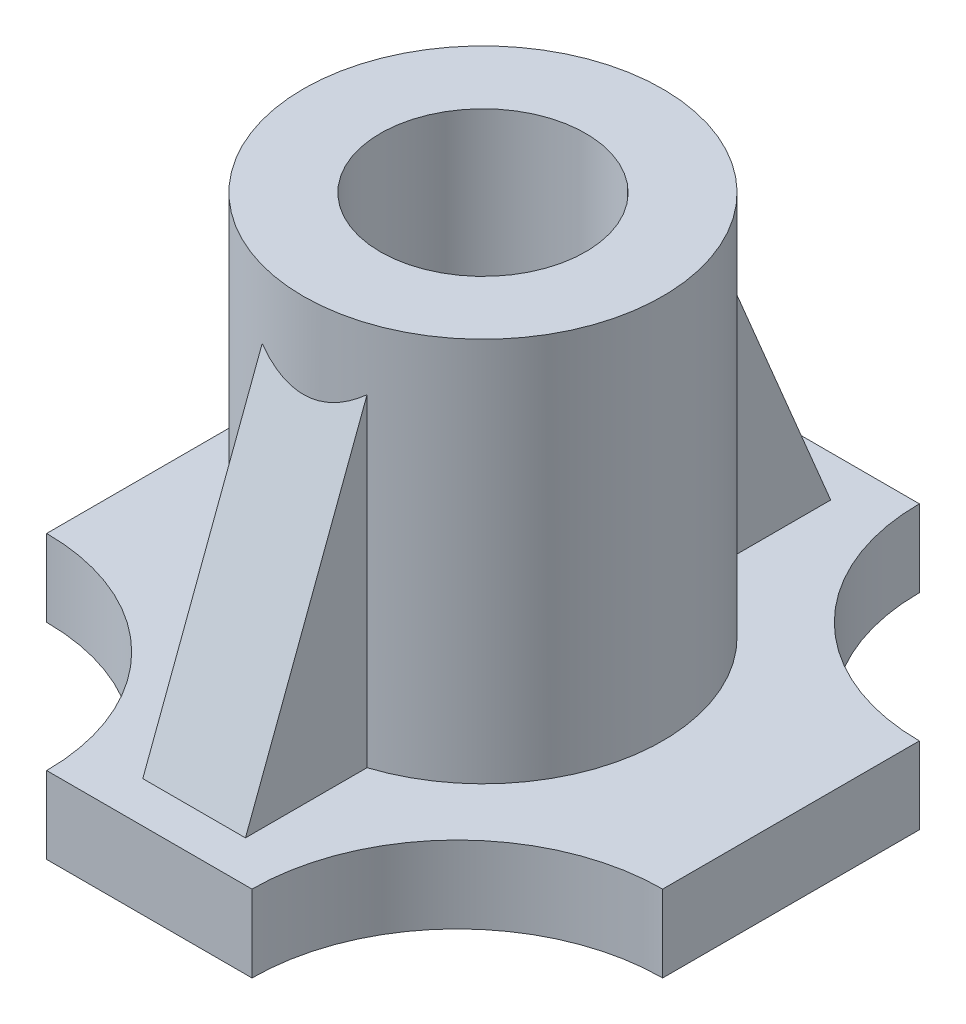
ISO-10303-21;
HEADER;
FILE_DESCRIPTION(('STEP AP214'),'2;1');
FILE_NAME('part.step','',(''),(''),'','','');
FILE_SCHEMA(('AUTOMOTIVE_DESIGN { 1 0 10303 214 1 1 1 1 }'));
ENDSEC;
DATA;
#1=APPLICATION_CONTEXT('core data for automotive mechanical design processes');
#2=APPLICATION_PROTOCOL_DEFINITION('international standard','automotive_design',2000,#1);
#3=PRODUCT_CONTEXT('',#1,'mechanical');
#4=PRODUCT('Part','Part','',(#3));
#5=PRODUCT_RELATED_PRODUCT_CATEGORY('part','',(#4));
#6=PRODUCT_DEFINITION_FORMATION('','',#4);
#7=PRODUCT_DEFINITION_CONTEXT('part definition',#1,'design');
#8=PRODUCT_DEFINITION('design','',#6,#7);
#9=PRODUCT_DEFINITION_SHAPE('','',#8);
#10=(LENGTH_UNIT() NAMED_UNIT(*) SI_UNIT(.MILLI.,.METRE.));
#11=(NAMED_UNIT(*) PLANE_ANGLE_UNIT() SI_UNIT($,.RADIAN.));
#12=(NAMED_UNIT(*) SI_UNIT($,.STERADIAN.) SOLID_ANGLE_UNIT());
#13=UNCERTAINTY_MEASURE_WITH_UNIT(LENGTH_MEASURE(1.E-05),#10,'distance_accuracy_value','');
#14=(GEOMETRIC_REPRESENTATION_CONTEXT(3) GLOBAL_UNCERTAINTY_ASSIGNED_CONTEXT((#13)) GLOBAL_UNIT_ASSIGNED_CONTEXT((#10,
#11,#12)) REPRESENTATION_CONTEXT('',''));
#15=CARTESIAN_POINT('',(0.,0.,0.));
#16=DIRECTION('',(0.,0.,1.));
#17=DIRECTION('',(1.,0.,0.));
#18=AXIS2_PLACEMENT_3D('',#15,#16,#17);
#19=CARTESIAN_POINT('',(59.2727272727272,-15.,0.));
#20=DIRECTION('',(1.,0.,0.));
#21=DIRECTION('',(0.,0.,-1.));
#22=AXIS2_PLACEMENT_3D('',#19,#20,#21);
#23=PLANE('',#22);
#24=DIRECTION('',(0.,1.,0.));
#25=VECTOR('',#24,1.);
#26=CARTESIAN_POINT('',(59.2727272727272,-15.,-90.));
#27=LINE('',#26,#25);
#28=CARTESIAN_POINT('',(59.2727272727272,0.,-90.));
#29=VERTEX_POINT('',#28);
#30=CARTESIAN_POINT('',(59.2727272727272,-15.,-90.));
#31=VERTEX_POINT('',#30);
#32=EDGE_CURVE('E228',#29,#31,#27,.F.);
#33=ORIENTED_EDGE('',*,*,#32,.F.);
#34=DIRECTION('',(0.,0.,-1.));
#35=VECTOR('',#34,1.);
#36=CARTESIAN_POINT('',(59.2727272727272,0.,0.));
#37=LINE('',#36,#35);
#38=CARTESIAN_POINT('',(59.2727272727272,0.,-40.));
#39=VERTEX_POINT('',#38);
#40=EDGE_CURVE('E230',#39,#29,#37,.T.);
#41=ORIENTED_EDGE('',*,*,#40,.F.);
#42=DIRECTION('',(0.,1.,0.));
#43=VECTOR('',#42,1.);
#44=CARTESIAN_POINT('',(59.2727272727272,-15.,-40.));
#45=LINE('',#44,#43);
#46=CARTESIAN_POINT('',(59.2727272727272,-15.,-40.));
#47=VERTEX_POINT('',#46);
#48=EDGE_CURVE('E216',#47,#39,#45,.T.);
#49=ORIENTED_EDGE('',*,*,#48,.F.);
#50=DIRECTION('',(0.,0.,-1.));
#51=VECTOR('',#50,1.);
#52=CARTESIAN_POINT('',(59.2727272727272,-15.,0.));
#53=LINE('',#52,#51);
#54=EDGE_CURVE('E231',#47,#31,#53,.T.);
#55=ORIENTED_EDGE('',*,*,#54,.T.);
#56=EDGE_LOOP('',(#33,#41,#49,#55));
#57=FACE_BOUND('',#56,.T.);
#58=ADVANCED_FACE('F39',(#57),#23,.T.);
#59=CARTESIAN_POINT('',(59.2727272727272,-15.,0.));
#60=DIRECTION('',(0.,0.,1.));
#61=DIRECTION('',(1.,0.,0.));
#62=AXIS2_PLACEMENT_3D('',#59,#60,#61);
#63=PLANE('',#62);
#64=DIRECTION('',(0.,1.,0.));
#65=VECTOR('',#64,1.);
#66=CARTESIAN_POINT('',(-20.7272727272728,-15.,0.));
#67=LINE('',#66,#65);
#68=CARTESIAN_POINT('',(-20.7272727272728,-15.,0.));
#69=VERTEX_POINT('',#68);
#70=CARTESIAN_POINT('',(-20.7272727272728,0.,0.));
#71=VERTEX_POINT('',#70);
#72=EDGE_CURVE('E220',#69,#71,#67,.T.);
#73=ORIENTED_EDGE('',*,*,#72,.F.);
#74=DIRECTION('',(1.,0.,0.));
#75=VECTOR('',#74,1.);
#76=CARTESIAN_POINT('',(59.2727272727272,-15.,0.));
#77=LINE('',#76,#75);
#78=CARTESIAN_POINT('',(19.2727272727272,-15.,0.));
#79=VERTEX_POINT('',#78);
#80=EDGE_CURVE('E241',#69,#79,#77,.T.);
#81=ORIENTED_EDGE('',*,*,#80,.T.);
#82=DIRECTION('',(0.,1.,0.));
#83=VECTOR('',#82,1.);
#84=CARTESIAN_POINT('',(19.2727272727272,-15.,0.));
#85=LINE('',#84,#83);
#86=CARTESIAN_POINT('',(19.2727272727272,0.,0.));
#87=VERTEX_POINT('',#86);
#88=EDGE_CURVE('E213',#87,#79,#85,.F.);
#89=ORIENTED_EDGE('',*,*,#88,.F.);
#90=DIRECTION('',(1.,0.,0.));
#91=VECTOR('',#90,1.);
#92=CARTESIAN_POINT('',(59.2727272727272,0.,0.));
#93=LINE('',#92,#91);
#94=EDGE_CURVE('E235',#71,#87,#93,.T.);
#95=ORIENTED_EDGE('',*,*,#94,.F.);
#96=EDGE_LOOP('',(#73,#81,#89,#95));
#97=FACE_BOUND('',#96,.T.);
#98=ADVANCED_FACE('F295',(#97),#63,.T.);
#99=CARTESIAN_POINT('',(-60.7272727272728,-15.,0.));
#100=DIRECTION('',(-1.,0.,0.));
#101=DIRECTION('',(0.,0.,1.));
#102=AXIS2_PLACEMENT_3D('',#99,#100,#101);
#103=PLANE('',#102);
#104=DIRECTION('',(0.,1.,0.));
#105=VECTOR('',#104,1.);
#106=CARTESIAN_POINT('',(-60.7272727272728,-15.,-89.9999999999999));
#107=LINE('',#106,#105);
#108=CARTESIAN_POINT('',(-60.7272727272728,-15.,-89.9999999999999));
#109=VERTEX_POINT('',#108);
#110=CARTESIAN_POINT('',(-60.7272727272728,0.,-89.9999999999999));
#111=VERTEX_POINT('',#110);
#112=EDGE_CURVE('E224',#109,#111,#107,.T.);
#113=ORIENTED_EDGE('',*,*,#112,.F.);
#114=DIRECTION('',(0.,0.,1.));
#115=VECTOR('',#114,1.);
#116=CARTESIAN_POINT('',(-60.7272727272728,-15.,0.));
#117=LINE('',#116,#115);
#118=CARTESIAN_POINT('',(-60.7272727272728,-15.,-40.));
#119=VERTEX_POINT('',#118);
#120=EDGE_CURVE('E238',#109,#119,#117,.T.);
#121=ORIENTED_EDGE('',*,*,#120,.T.);
#122=DIRECTION('',(0.,1.,0.));
#123=VECTOR('',#122,1.);
#124=CARTESIAN_POINT('',(-60.7272727272728,-15.,-40.));
#125=LINE('',#124,#123);
#126=CARTESIAN_POINT('',(-60.7272727272728,0.,-40.));
#127=VERTEX_POINT('',#126);
#128=EDGE_CURVE('E218',#127,#119,#125,.F.);
#129=ORIENTED_EDGE('',*,*,#128,.F.);
#130=DIRECTION('',(0.,0.,1.));
#131=VECTOR('',#130,1.);
#132=CARTESIAN_POINT('',(-60.7272727272728,0.,0.));
#133=LINE('',#132,#131);
#134=EDGE_CURVE('E250',#111,#127,#133,.T.);
#135=ORIENTED_EDGE('',*,*,#134,.F.);
#136=EDGE_LOOP('',(#113,#121,#129,#135));
#137=FACE_BOUND('',#136,.T.);
#138=ADVANCED_FACE('F300',(#137),#103,.T.);
#139=CARTESIAN_POINT('',(59.2727272727272,-15.,-130.));
#140=DIRECTION('',(0.,0.,-1.));
#141=DIRECTION('',(-1.,0.,0.));
#142=AXIS2_PLACEMENT_3D('',#139,#140,#141);
#143=PLANE('',#142);
#144=DIRECTION('',(0.,1.,0.));
#145=VECTOR('',#144,1.);
#146=CARTESIAN_POINT('',(19.2727272727272,-15.,-130.));
#147=LINE('',#146,#145);
#148=CARTESIAN_POINT('',(19.2727272727272,-15.,-130.));
#149=VERTEX_POINT('',#148);
#150=CARTESIAN_POINT('',(19.2727272727272,0.,-130.));
#151=VERTEX_POINT('',#150);
#152=EDGE_CURVE('E226',#149,#151,#147,.T.);
#153=ORIENTED_EDGE('',*,*,#152,.F.);
#154=DIRECTION('',(-1.,0.,0.));
#155=VECTOR('',#154,1.);
#156=CARTESIAN_POINT('',(59.2727272727272,-15.,-130.));
#157=LINE('',#156,#155);
#158=CARTESIAN_POINT('',(-20.7272727272728,-15.,-130.));
#159=VERTEX_POINT('',#158);
#160=EDGE_CURVE('E234',#149,#159,#157,.T.);
#161=ORIENTED_EDGE('',*,*,#160,.T.);
#162=DIRECTION('',(0.,1.,0.));
#163=VECTOR('',#162,1.);
#164=CARTESIAN_POINT('',(-20.7272727272728,-15.,-130.));
#165=LINE('',#164,#163);
#166=CARTESIAN_POINT('',(-20.7272727272728,0.,-130.));
#167=VERTEX_POINT('',#166);
#168=EDGE_CURVE('E222',#167,#159,#165,.F.);
#169=ORIENTED_EDGE('',*,*,#168,.F.);
#170=DIRECTION('',(-1.,0.,0.));
#171=VECTOR('',#170,1.);
#172=CARTESIAN_POINT('',(59.2727272727272,0.,-130.));
#173=LINE('',#172,#171);
#174=EDGE_CURVE('E247',#151,#167,#173,.T.);
#175=ORIENTED_EDGE('',*,*,#174,.F.);
#176=EDGE_LOOP('',(#153,#161,#169,#175));
#177=FACE_BOUND('',#176,.T.);
#178=ADVANCED_FACE('F325',(#177),#143,.T.);
#179=CARTESIAN_POINT('',(27.,-15.,0.));
#180=DIRECTION('',(0.,1.,0.));
#181=DIRECTION('',(0.,0.,1.));
#182=AXIS2_PLACEMENT_3D('',#179,#180,#181);
#183=PLANE('',#182);
#184=ORIENTED_EDGE('',*,*,#160,.F.);
#185=CARTESIAN_POINT('',(59.2727272727272,-15.,-130.));
#186=DIRECTION('',(0.,1.,0.));
#187=DIRECTION('',(0.,0.,1.));
#188=AXIS2_PLACEMENT_3D('',#185,#186,#187);
#189=CIRCLE('',#188,40.);
#190=EDGE_CURVE('E194',#149,#31,#189,.T.);
#191=ORIENTED_EDGE('',*,*,#190,.T.);
#192=ORIENTED_EDGE('',*,*,#54,.F.);
#193=CARTESIAN_POINT('',(59.2727272727272,-15.,0.));
#194=DIRECTION('',(0.,1.,0.));
#195=DIRECTION('',(0.,0.,1.));
#196=AXIS2_PLACEMENT_3D('',#193,#194,#195);
#197=CIRCLE('',#196,40.);
#198=EDGE_CURVE('E210',#47,#79,#197,.T.);
#199=ORIENTED_EDGE('',*,*,#198,.T.);
#200=ORIENTED_EDGE('',*,*,#80,.F.);
#201=CARTESIAN_POINT('',(-60.7272727272728,-15.,0.));
#202=DIRECTION('',(0.,1.,0.));
#203=DIRECTION('',(0.,0.,1.));
#204=AXIS2_PLACEMENT_3D('',#201,#202,#203);
#205=CIRCLE('',#204,40.);
#206=EDGE_CURVE('E200',#69,#119,#205,.T.);
#207=ORIENTED_EDGE('',*,*,#206,.T.);
#208=ORIENTED_EDGE('',*,*,#120,.F.);
#209=CARTESIAN_POINT('',(-60.7272727272728,-15.,-130.));
#210=DIRECTION('',(0.,1.,0.));
#211=DIRECTION('',(0.,0.,1.));
#212=AXIS2_PLACEMENT_3D('',#209,#210,#211);
#213=CIRCLE('',#212,40.);
#214=EDGE_CURVE('E205',#109,#159,#213,.T.);
#215=ORIENTED_EDGE('',*,*,#214,.T.);
#216=EDGE_LOOP('',(#184,#191,#192,#199,#200,#207,#208,#215));
#217=FACE_BOUND('',#216,.T.);
#218=ADVANCED_FACE('F320',(#217),#183,.F.);
#219=CARTESIAN_POINT('',(27.,0.,0.));
#220=DIRECTION('',(0.,1.,0.));
#221=DIRECTION('',(0.,0.,1.));
#222=AXIS2_PLACEMENT_3D('',#219,#220,#221);
#223=PLANE('',#222);
#224=DIRECTION('',(0.,0.,1.));
#225=VECTOR('',#224,1.);
#226=CARTESIAN_POINT('',(10.,0.,0.));
#227=LINE('',#226,#225);
#228=CARTESIAN_POINT('',(10.,0.,-122.));
#229=VERTEX_POINT('',#228);
#230=CARTESIAN_POINT('',(10.,0.,-98.3155462184655));
#231=VERTEX_POINT('',#230);
#232=EDGE_CURVE('E161',#229,#231,#227,.T.);
#233=ORIENTED_EDGE('',*,*,#232,.T.);
#234=CARTESIAN_POINT('',(-0.727272727272774,0.,-65.));
#235=DIRECTION('',(0.,1.,0.));
#236=DIRECTION('',(0.,0.,1.));
#237=AXIS2_PLACEMENT_3D('',#234,#235,#236);
#238=CIRCLE('',#237,35.);
#239=CARTESIAN_POINT('',(9.91879627784451,0.,-31.6584161333286));
#240=VERTEX_POINT('',#239);
#241=EDGE_CURVE('E195',#240,#231,#238,.T.);
#242=ORIENTED_EDGE('',*,*,#241,.F.);
#243=DIRECTION('',(-1.,0.,0.));
#244=VECTOR('',#243,1.);
#245=CARTESIAN_POINT('',(10.,0.,-31.6584161333286));
#246=LINE('',#245,#244);
#247=CARTESIAN_POINT('',(10.,0.,-31.6584161333286));
#248=VERTEX_POINT('',#247);
#249=EDGE_CURVE('E182',#248,#240,#246,.T.);
#250=ORIENTED_EDGE('',*,*,#249,.F.);
#251=DIRECTION('',(0.,0.,1.));
#252=VECTOR('',#251,1.);
#253=CARTESIAN_POINT('',(10.,0.,0.));
#254=LINE('',#253,#252);
#255=CARTESIAN_POINT('',(10.,0.,-8.));
#256=VERTEX_POINT('',#255);
#257=EDGE_CURVE('E169',#248,#256,#254,.T.);
#258=ORIENTED_EDGE('',*,*,#257,.T.);
#259=DIRECTION('',(-1.,0.,0.));
#260=VECTOR('',#259,1.);
#261=CARTESIAN_POINT('',(10.,0.,-8.));
#262=LINE('',#261,#260);
#263=CARTESIAN_POINT('',(-10.,0.,-8.));
#264=VERTEX_POINT('',#263);
#265=EDGE_CURVE('E185',#256,#264,#262,.T.);
#266=ORIENTED_EDGE('',*,*,#265,.T.);
#267=DIRECTION('',(0.,0.,1.));
#268=VECTOR('',#267,1.);
#269=CARTESIAN_POINT('',(-10.,0.,0.));
#270=LINE('',#269,#268);
#271=CARTESIAN_POINT('',(-10.,0.,-31.2506810598255));
#272=VERTEX_POINT('',#271);
#273=EDGE_CURVE('E170',#272,#264,#270,.T.);
#274=ORIENTED_EDGE('',*,*,#273,.F.);
#275=CARTESIAN_POINT('',(-10.,0.,-98.7493189401745));
#276=VERTEX_POINT('',#275);
#277=EDGE_CURVE('E190',#276,#272,#238,.T.);
#278=ORIENTED_EDGE('',*,*,#277,.F.);
#279=DIRECTION('',(0.,0.,1.));
#280=VECTOR('',#279,1.);
#281=CARTESIAN_POINT('',(-10.,0.,0.));
#282=LINE('',#281,#280);
#283=CARTESIAN_POINT('',(-10.,0.,-122.));
#284=VERTEX_POINT('',#283);
#285=EDGE_CURVE('E58',#284,#276,#282,.T.);
#286=ORIENTED_EDGE('',*,*,#285,.F.);
#287=DIRECTION('',(-1.,0.,0.));
#288=VECTOR('',#287,1.);
#289=CARTESIAN_POINT('',(10.,0.,-122.));
#290=LINE('',#289,#288);
#291=EDGE_CURVE('E53',#229,#284,#290,.T.);
#292=ORIENTED_EDGE('',*,*,#291,.F.);
#293=EDGE_LOOP('',(#233,#242,#250,#258,#266,#274,#278,#286,#292));
#294=FACE_BOUND('',#293,.T.);
#295=CARTESIAN_POINT('',(59.2727272727272,0.,-130.));
#296=DIRECTION('',(0.,1.,0.));
#297=DIRECTION('',(0.,0.,1.));
#298=AXIS2_PLACEMENT_3D('',#295,#296,#297);
#299=CIRCLE('',#298,40.);
#300=EDGE_CURVE('E244',#151,#29,#299,.T.);
#301=ORIENTED_EDGE('',*,*,#300,.F.);
#302=ORIENTED_EDGE('',*,*,#174,.T.);
#303=CARTESIAN_POINT('',(-60.7272727272728,0.,-130.));
#304=DIRECTION('',(0.,1.,0.));
#305=DIRECTION('',(0.,0.,1.));
#306=AXIS2_PLACEMENT_3D('',#303,#304,#305);
#307=CIRCLE('',#306,40.);
#308=EDGE_CURVE('E203',#111,#167,#307,.T.);
#309=ORIENTED_EDGE('',*,*,#308,.F.);
#310=ORIENTED_EDGE('',*,*,#134,.T.);
#311=CARTESIAN_POINT('',(-60.7272727272728,0.,0.));
#312=DIRECTION('',(0.,1.,0.));
#313=DIRECTION('',(0.,0.,1.));
#314=AXIS2_PLACEMENT_3D('',#311,#312,#313);
#315=CIRCLE('',#314,40.);
#316=EDGE_CURVE('E197',#71,#127,#315,.T.);
#317=ORIENTED_EDGE('',*,*,#316,.F.);
#318=ORIENTED_EDGE('',*,*,#94,.T.);
#319=CARTESIAN_POINT('',(59.2727272727272,0.,0.));
#320=DIRECTION('',(0.,1.,0.));
#321=DIRECTION('',(0.,0.,1.));
#322=AXIS2_PLACEMENT_3D('',#319,#320,#321);
#323=CIRCLE('',#322,40.);
#324=EDGE_CURVE('E199',#39,#87,#323,.T.);
#325=ORIENTED_EDGE('',*,*,#324,.F.);
#326=ORIENTED_EDGE('',*,*,#40,.T.);
#327=EDGE_LOOP('',(#301,#302,#309,#310,#317,#318,#325,#326));
#328=FACE_BOUND('',#327,.T.);
#329=ADVANCED_FACE('F268',(#294,#328),#223,.T.);
#330=CARTESIAN_POINT('',(59.2727272727272,-15.,0.));
#331=DIRECTION('',(0.,1.,0.));
#332=DIRECTION('',(0.,0.,1.));
#333=AXIS2_PLACEMENT_3D('',#330,#331,#332);
#334=CYLINDRICAL_SURFACE('',#333,40.);
#335=ORIENTED_EDGE('',*,*,#48,.T.);
#336=ORIENTED_EDGE('',*,*,#324,.T.);
#337=ORIENTED_EDGE('',*,*,#88,.T.);
#338=ORIENTED_EDGE('',*,*,#198,.F.);
#339=EDGE_LOOP('',(#335,#336,#337,#338));
#340=FACE_BOUND('',#339,.T.);
#341=ADVANCED_FACE('F315',(#340),#334,.F.);
#342=CARTESIAN_POINT('',(-60.7272727272728,-15.,0.));
#343=DIRECTION('',(0.,1.,0.));
#344=DIRECTION('',(0.,0.,1.));
#345=AXIS2_PLACEMENT_3D('',#342,#343,#344);
#346=CYLINDRICAL_SURFACE('',#345,40.);
#347=ORIENTED_EDGE('',*,*,#72,.T.);
#348=ORIENTED_EDGE('',*,*,#316,.T.);
#349=ORIENTED_EDGE('',*,*,#128,.T.);
#350=ORIENTED_EDGE('',*,*,#206,.F.);
#351=EDGE_LOOP('',(#347,#348,#349,#350));
#352=FACE_BOUND('',#351,.T.);
#353=ADVANCED_FACE('F334',(#352),#346,.F.);
#354=CARTESIAN_POINT('',(-60.7272727272728,-15.,-130.));
#355=DIRECTION('',(0.,1.,0.));
#356=DIRECTION('',(0.,0.,1.));
#357=AXIS2_PLACEMENT_3D('',#354,#355,#356);
#358=CYLINDRICAL_SURFACE('',#357,40.);
#359=ORIENTED_EDGE('',*,*,#112,.T.);
#360=ORIENTED_EDGE('',*,*,#308,.T.);
#361=ORIENTED_EDGE('',*,*,#168,.T.);
#362=ORIENTED_EDGE('',*,*,#214,.F.);
#363=EDGE_LOOP('',(#359,#360,#361,#362));
#364=FACE_BOUND('',#363,.T.);
#365=ADVANCED_FACE('F336',(#364),#358,.F.);
#366=CARTESIAN_POINT('',(59.2727272727272,-15.,-130.));
#367=DIRECTION('',(0.,1.,0.));
#368=DIRECTION('',(0.,0.,1.));
#369=AXIS2_PLACEMENT_3D('',#366,#367,#368);
#370=CYLINDRICAL_SURFACE('',#369,40.);
#371=ORIENTED_EDGE('',*,*,#32,.T.);
#372=ORIENTED_EDGE('',*,*,#190,.F.);
#373=ORIENTED_EDGE('',*,*,#152,.T.);
#374=ORIENTED_EDGE('',*,*,#300,.T.);
#375=EDGE_LOOP('',(#371,#372,#373,#374));
#376=FACE_BOUND('',#375,.T.);
#377=ADVANCED_FACE('F323',(#376),#370,.F.);
#378=CARTESIAN_POINT('',(-0.727272727272774,75.,-65.));
#379=DIRECTION('',(0.,1.,0.));
#380=DIRECTION('',(0.,0.,1.));
#381=AXIS2_PLACEMENT_3D('',#378,#379,#380);
#382=PLANE('',#381);
#383=CARTESIAN_POINT('',(-0.727272727272774,75.,-65.));
#384=DIRECTION('',(0.,1.,0.));
#385=DIRECTION('',(0.,0.,1.));
#386=AXIS2_PLACEMENT_3D('',#383,#384,#385);
#387=CIRCLE('',#386,35.);
#388=CARTESIAN_POINT('',(-0.727272727272774,75.,-30.));
#389=VERTEX_POINT('',#388);
#390=EDGE_CURVE('E191',#389,#389,#387,.T.);
#391=ORIENTED_EDGE('',*,*,#390,.T.);
#392=EDGE_LOOP('',(#391));
#393=FACE_BOUND('',#392,.T.);
#394=CARTESIAN_POINT('',(-0.727272727272774,75.,-65.));
#395=DIRECTION('',(0.,1.,0.));
#396=DIRECTION('',(0.,0.,1.));
#397=AXIS2_PLACEMENT_3D('',#394,#395,#396);
#398=CIRCLE('',#397,20.);
#399=CARTESIAN_POINT('',(-0.727272727272774,75.,-45.));
#400=VERTEX_POINT('',#399);
#401=EDGE_CURVE('E187',#400,#400,#398,.T.);
#402=ORIENTED_EDGE('',*,*,#401,.F.);
#403=EDGE_LOOP('',(#402));
#404=FACE_BOUND('',#403,.T.);
#405=ADVANCED_FACE('F348',(#393,#404),#382,.T.);
#406=CARTESIAN_POINT('',(-0.727272727272774,75.,-65.));
#407=DIRECTION('',(0.,-1.,0.));
#408=DIRECTION('',(0.,0.,-1.));
#409=AXIS2_PLACEMENT_3D('',#406,#407,#408);
#410=CYLINDRICAL_SURFACE('',#409,35.);
#411=ORIENTED_EDGE('',*,*,#390,.F.);
#412=EDGE_LOOP('',(#411));
#413=FACE_BOUND('',#412,.T.);
#414=ORIENTED_EDGE('',*,*,#241,.T.);
#415=DIRECTION('',(0.,-1.,0.));
#416=VECTOR('',#415,1.);
#417=CARTESIAN_POINT('',(10.,75.,-98.3155462184655));
#418=LINE('',#417,#416);
#419=CARTESIAN_POINT('',(10.,56.7081251893333,-98.3155462184655));
#420=VERTEX_POINT('',#419);
#421=EDGE_CURVE('E11',#231,#420,#418,.F.);
#422=ORIENTED_EDGE('',*,*,#421,.T.);
#423=CARTESIAN_POINT('',(-0.727272727272774,136.476152906346,-65.));
#424=DIRECTION('',(0.,0.385392627746897,-0.922752687602882));
#425=DIRECTION('',(0.,-0.922752687602882,-0.385392627746898));
#426=AXIS2_PLACEMENT_3D('',#423,#424,#425);
#427=ELLIPSE('',#426,90.8164751480038,35.);
#428=CARTESIAN_POINT('',(-10.,55.6695351490779,-98.7493189401745));
#429=VERTEX_POINT('',#428);
#430=EDGE_CURVE('E46',#420,#429,#427,.T.);
#431=ORIENTED_EDGE('',*,*,#430,.T.);
#432=DIRECTION('',(0.,-1.,0.));
#433=VECTOR('',#432,1.);
#434=CARTESIAN_POINT('',(-10.,75.,-98.7493189401745));
#435=LINE('',#434,#433);
#436=EDGE_CURVE('E146',#276,#429,#435,.F.);
#437=ORIENTED_EDGE('',*,*,#436,.F.);
#438=ORIENTED_EDGE('',*,*,#277,.T.);
#439=DIRECTION('',(0.,-1.,0.));
#440=VECTOR('',#439,1.);
#441=CARTESIAN_POINT('',(-10.,75.,-31.2506810598255));
#442=LINE('',#441,#440);
#443=CARTESIAN_POINT('',(-10.,61.7680719774004,-31.2506810598255));
#444=VERTEX_POINT('',#443);
#445=EDGE_CURVE('E259',#444,#272,#442,.T.);
#446=ORIENTED_EDGE('',*,*,#445,.F.);
#447=CARTESIAN_POINT('',(-0.727272727272774,151.426966532835,-65.));
#448=DIRECTION('',(0.,0.352287539529663,0.935891815057775));
#449=DIRECTION('',(0.,-0.935891815057775,0.352287539529663));
#450=AXIS2_PLACEMENT_3D('',#447,#448,#449);
#451=ELLIPSE('',#450,99.3506612431661,35.);
#452=CARTESIAN_POINT('',(9.91879627784448,62.8512664568674,-31.6584161333286));
#453=VERTEX_POINT('',#452);
#454=EDGE_CURVE('E262',#444,#453,#451,.T.);
#455=ORIENTED_EDGE('',*,*,#454,.T.);
#456=DIRECTION('',(0.,-1.,0.));
#457=VECTOR('',#456,1.);
#458=CARTESIAN_POINT('',(9.91879627784451,75.,-31.6584161333286));
#459=LINE('',#458,#457);
#460=EDGE_CURVE('E154',#453,#240,#459,.T.);
#461=ORIENTED_EDGE('',*,*,#460,.T.);
#462=EDGE_LOOP('',(#414,#422,#431,#437,#438,#446,#455,#461));
#463=FACE_BOUND('',#462,.T.);
#464=ADVANCED_FACE('F145',(#413,#463),#410,.T.);
#465=CARTESIAN_POINT('',(-0.727272727272774,75.,-65.));
#466=DIRECTION('',(0.,-1.,0.));
#467=DIRECTION('',(0.,0.,-1.));
#468=AXIS2_PLACEMENT_3D('',#465,#466,#467);
#469=CYLINDRICAL_SURFACE('',#468,20.);
#470=ORIENTED_EDGE('',*,*,#401,.T.);
#471=EDGE_LOOP('',(#470));
#472=FACE_BOUND('',#471,.T.);
#473=CARTESIAN_POINT('',(-0.727272727272774,0.,-65.));
#474=DIRECTION('',(0.,1.,0.));
#475=DIRECTION('',(0.,0.,1.));
#476=AXIS2_PLACEMENT_3D('',#473,#474,#475);
#477=CIRCLE('',#476,20.);
#478=CARTESIAN_POINT('',(-0.727272727272774,0.,-45.));
#479=VERTEX_POINT('',#478);
#480=EDGE_CURVE('E256',#479,#479,#477,.F.);
#481=ORIENTED_EDGE('',*,*,#480,.T.);
#482=EDGE_LOOP('',(#481));
#483=FACE_BOUND('',#482,.T.);
#484=ADVANCED_FACE('F407',(#472,#483),#469,.F.);
#485=ORIENTED_EDGE('',*,*,#480,.F.);
#486=EDGE_LOOP('',(#485));
#487=FACE_BOUND('',#486,.T.);
#488=ADVANCED_FACE('F291',(#487),#223,.T.);
#489=CARTESIAN_POINT('',(10.,0.,-31.6584161333286));
#490=DIRECTION('',(0.,0.,-1.));
#491=DIRECTION('',(-1.,0.,0.));
#492=AXIS2_PLACEMENT_3D('',#489,#490,#491);
#493=PLANE('',#492);
#494=ORIENTED_EDGE('',*,*,#460,.F.);
#495=DIRECTION('',(-1.,0.,0.));
#496=VECTOR('',#495,1.);
#497=CARTESIAN_POINT('',(10.,62.8512664568674,-31.6584161333286));
#498=LINE('',#497,#496);
#499=CARTESIAN_POINT('',(10.,62.8512664568674,-31.6584161333286));
#500=VERTEX_POINT('',#499);
#501=EDGE_CURVE('E175',#500,#453,#498,.T.);
#502=ORIENTED_EDGE('',*,*,#501,.F.);
#503=DIRECTION('',(0.,-1.,0.));
#504=VECTOR('',#503,1.);
#505=CARTESIAN_POINT('',(10.,0.,-31.6584161333286));
#506=LINE('',#505,#504);
#507=EDGE_CURVE('E172',#500,#248,#506,.T.);
#508=ORIENTED_EDGE('',*,*,#507,.T.);
#509=ORIENTED_EDGE('',*,*,#249,.T.);
#510=EDGE_LOOP('',(#494,#502,#508,#509));
#511=FACE_BOUND('',#510,.T.);
#512=ADVANCED_FACE('F272',(#511),#493,.T.);
#513=CARTESIAN_POINT('',(-10.,0.,0.));
#514=DIRECTION('',(1.,0.,0.));
#515=DIRECTION('',(0.,0.,-1.));
#516=AXIS2_PLACEMENT_3D('',#513,#514,#515);
#517=PLANE('',#516);
#518=DIRECTION('',(0.,0.935891815057775,-0.352287539529663));
#519=VECTOR('',#518,1.);
#520=CARTESIAN_POINT('',(-10.,-2.63762419834123,-7.00714791593709));
#521=LINE('',#520,#519);
#522=EDGE_CURVE('E165',#264,#444,#521,.T.);
#523=ORIENTED_EDGE('',*,*,#522,.T.);
#524=ORIENTED_EDGE('',*,*,#445,.T.);
#525=ORIENTED_EDGE('',*,*,#273,.T.);
#526=EDGE_LOOP('',(#523,#524,#525));
#527=FACE_BOUND('',#526,.T.);
#528=ADVANCED_FACE('F283',(#527),#517,.F.);
#529=CARTESIAN_POINT('',(10.,-2.63762419834123,-7.00714791593709));
#530=DIRECTION('',(0.,0.352287539529663,0.935891815057775));
#531=DIRECTION('',(0.,-0.935891815057775,0.352287539529663));
#532=AXIS2_PLACEMENT_3D('',#529,#530,#531);
#533=PLANE('',#532);
#534=ORIENTED_EDGE('',*,*,#454,.F.);
#535=ORIENTED_EDGE('',*,*,#522,.F.);
#536=ORIENTED_EDGE('',*,*,#265,.F.);
#537=DIRECTION('',(0.,0.935891815057775,-0.352287539529663));
#538=VECTOR('',#537,1.);
#539=CARTESIAN_POINT('',(10.,-2.63762419834123,-7.00714791593709));
#540=LINE('',#539,#538);
#541=EDGE_CURVE('E166',#256,#500,#540,.T.);
#542=ORIENTED_EDGE('',*,*,#541,.T.);
#543=ORIENTED_EDGE('',*,*,#501,.T.);
#544=EDGE_LOOP('',(#534,#535,#536,#542,#543));
#545=FACE_BOUND('',#544,.T.);
#546=ADVANCED_FACE('F281',(#545),#533,.T.);
#547=CARTESIAN_POINT('',(10.,0.,0.));
#548=DIRECTION('',(1.,0.,0.));
#549=DIRECTION('',(0.,0.,-1.));
#550=AXIS2_PLACEMENT_3D('',#547,#548,#549);
#551=PLANE('',#550);
#552=ORIENTED_EDGE('',*,*,#541,.F.);
#553=ORIENTED_EDGE('',*,*,#257,.F.);
#554=ORIENTED_EDGE('',*,*,#507,.F.);
#555=EDGE_LOOP('',(#552,#553,#554));
#556=FACE_BOUND('',#555,.T.);
#557=ADVANCED_FACE('F276',(#556),#551,.T.);
#558=CARTESIAN_POINT('',(10.,0.,0.));
#559=DIRECTION('',(1.,0.,0.));
#560=DIRECTION('',(0.,0.,-1.));
#561=AXIS2_PLACEMENT_3D('',#558,#559,#560);
#562=PLANE('',#561);
#563=ORIENTED_EDGE('',*,*,#421,.F.);
#564=ORIENTED_EDGE('',*,*,#232,.F.);
#565=DIRECTION('',(0.,-0.922752687602882,-0.385392627746898));
#566=VECTOR('',#565,1.);
#567=CARTESIAN_POINT('',(10.,43.3858941303659,-103.879647742358));
#568=LINE('',#567,#566);
#569=EDGE_CURVE('E158',#420,#229,#568,.T.);
#570=ORIENTED_EDGE('',*,*,#569,.F.);
#571=EDGE_LOOP('',(#563,#564,#570));
#572=FACE_BOUND('',#571,.T.);
#573=ADVANCED_FACE('F446',(#572),#562,.T.);
#574=CARTESIAN_POINT('',(-10.,0.,0.));
#575=DIRECTION('',(1.,0.,0.));
#576=DIRECTION('',(0.,0.,-1.));
#577=AXIS2_PLACEMENT_3D('',#574,#575,#576);
#578=PLANE('',#577);
#579=ORIENTED_EDGE('',*,*,#285,.T.);
#580=ORIENTED_EDGE('',*,*,#436,.T.);
#581=DIRECTION('',(0.,-0.922752687602882,-0.385392627746898));
#582=VECTOR('',#581,1.);
#583=CARTESIAN_POINT('',(-10.,43.3858941303659,-103.879647742358));
#584=LINE('',#583,#582);
#585=EDGE_CURVE('E153',#429,#284,#584,.T.);
#586=ORIENTED_EDGE('',*,*,#585,.T.);
#587=EDGE_LOOP('',(#579,#580,#586));
#588=FACE_BOUND('',#587,.T.);
#589=ADVANCED_FACE('F152',(#588),#578,.F.);
#590=CARTESIAN_POINT('',(10.,43.3858941303659,-103.879647742358));
#591=DIRECTION('',(0.,0.385392627746897,-0.922752687602882));
#592=DIRECTION('',(0.,0.922752687602882,0.385392627746897));
#593=AXIS2_PLACEMENT_3D('',#590,#591,#592);
#594=PLANE('',#593);
#595=ORIENTED_EDGE('',*,*,#430,.F.);
#596=ORIENTED_EDGE('',*,*,#569,.T.);
#597=ORIENTED_EDGE('',*,*,#291,.T.);
#598=ORIENTED_EDGE('',*,*,#585,.F.);
#599=EDGE_LOOP('',(#595,#596,#597,#598));
#600=FACE_BOUND('',#599,.T.);
#601=ADVANCED_FACE('F156',(#600),#594,.T.);
#602=CLOSED_SHELL('',(#58,#98,#138,#178,#218,#329,#341,#353,#365,#377,#405,#464,#484,#488,#512,
#528,#546,#557,#573,#589,#601));
#603=MANIFOLD_SOLID_BREP('B2',#602);
#604=ADVANCED_BREP_SHAPE_REPRESENTATION('',(#18,#603),#14);
#605=SHAPE_DEFINITION_REPRESENTATION(#9,#604);
ENDSEC;
END-ISO-10303-21;
